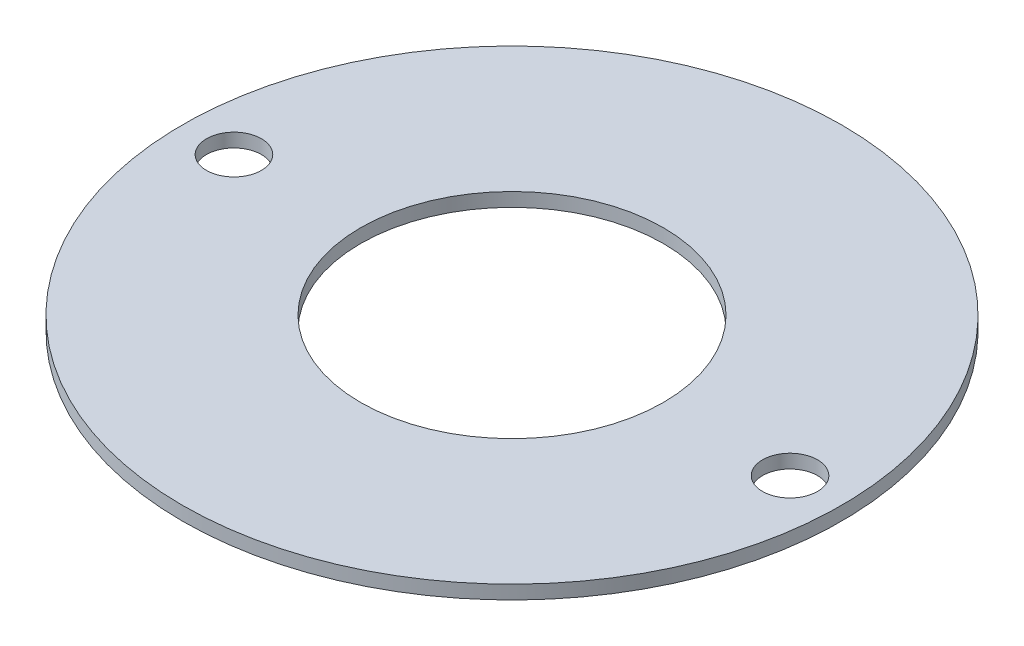
ISO-10303-21;
HEADER;
FILE_DESCRIPTION(('STEP AP214'),'2;1');
FILE_NAME('part.step','',(''),(''),'','','');
FILE_SCHEMA(('AUTOMOTIVE_DESIGN { 1 0 10303 214 1 1 1 1 }'));
ENDSEC;
DATA;
#1=APPLICATION_CONTEXT('core data for automotive mechanical design processes');
#2=APPLICATION_PROTOCOL_DEFINITION('international standard','automotive_design',2000,#1);
#3=PRODUCT_CONTEXT('',#1,'mechanical');
#4=PRODUCT('Part','Part','',(#3));
#5=PRODUCT_RELATED_PRODUCT_CATEGORY('part','',(#4));
#6=PRODUCT_DEFINITION_FORMATION('','',#4);
#7=PRODUCT_DEFINITION_CONTEXT('part definition',#1,'design');
#8=PRODUCT_DEFINITION('design','',#6,#7);
#9=PRODUCT_DEFINITION_SHAPE('','',#8);
#10=(LENGTH_UNIT() NAMED_UNIT(*) SI_UNIT(.MILLI.,.METRE.));
#11=(NAMED_UNIT(*) PLANE_ANGLE_UNIT() SI_UNIT($,.RADIAN.));
#12=(NAMED_UNIT(*) SI_UNIT($,.STERADIAN.) SOLID_ANGLE_UNIT());
#13=UNCERTAINTY_MEASURE_WITH_UNIT(LENGTH_MEASURE(1.E-05),#10,'distance_accuracy_value','');
#14=(GEOMETRIC_REPRESENTATION_CONTEXT(3) GLOBAL_UNCERTAINTY_ASSIGNED_CONTEXT((#13)) GLOBAL_UNIT_ASSIGNED_CONTEXT((#10,
#11,#12)) REPRESENTATION_CONTEXT('',''));
#15=CARTESIAN_POINT('',(0.,0.,0.));
#16=DIRECTION('',(0.,0.,1.));
#17=DIRECTION('',(1.,0.,0.));
#18=AXIS2_PLACEMENT_3D('',#15,#16,#17);
#19=CARTESIAN_POINT('',(0.,3.175,0.));
#20=DIRECTION('',(0.,-1.,0.));
#21=DIRECTION('',(0.,0.,-1.));
#22=AXIS2_PLACEMENT_3D('',#19,#20,#21);
#23=CYLINDRICAL_SURFACE('',#22,76.2);
#24=CARTESIAN_POINT('',(0.,3.175,0.));
#25=DIRECTION('',(0.,1.,0.));
#26=DIRECTION('',(0.,0.,1.));
#27=AXIS2_PLACEMENT_3D('',#24,#25,#26);
#28=CIRCLE('',#27,76.2);
#29=CARTESIAN_POINT('',(0.,3.175,76.2));
#30=VERTEX_POINT('',#29);
#31=EDGE_CURVE('E12',#30,#30,#28,.T.);
#32=ORIENTED_EDGE('',*,*,#31,.F.);
#33=EDGE_LOOP('',(#32));
#34=FACE_BOUND('',#33,.T.);
#35=CARTESIAN_POINT('',(0.,0.,0.));
#36=DIRECTION('',(0.,1.,0.));
#37=DIRECTION('',(0.,0.,1.));
#38=AXIS2_PLACEMENT_3D('',#35,#36,#37);
#39=CIRCLE('',#38,76.2);
#40=CARTESIAN_POINT('',(0.,0.,76.2));
#41=VERTEX_POINT('',#40);
#42=EDGE_CURVE('E49',#41,#41,#39,.T.);
#43=ORIENTED_EDGE('',*,*,#42,.T.);
#44=EDGE_LOOP('',(#43));
#45=FACE_BOUND('',#44,.T.);
#46=ADVANCED_FACE('F42',(#34,#45),#23,.T.);
#47=CARTESIAN_POINT('',(0.,3.175,0.));
#48=DIRECTION('',(0.,1.,0.));
#49=DIRECTION('',(0.,0.,1.));
#50=AXIS2_PLACEMENT_3D('',#47,#48,#49);
#51=PLANE('',#50);
#52=CARTESIAN_POINT('',(64.2875,3.175,0.));
#53=DIRECTION('',(0.,1.,0.));
#54=DIRECTION('',(0.,0.,1.));
#55=AXIS2_PLACEMENT_3D('',#52,#53,#54);
#56=CIRCLE('',#55,6.35);
#57=CARTESIAN_POINT('',(64.2875,3.175,6.35));
#58=VERTEX_POINT('',#57);
#59=EDGE_CURVE('E70',#58,#58,#56,.T.);
#60=ORIENTED_EDGE('',*,*,#59,.F.);
#61=EDGE_LOOP('',(#60));
#62=FACE_BOUND('',#61,.T.);
#63=CARTESIAN_POINT('',(-64.2875,3.175,0.));
#64=DIRECTION('',(0.,1.,0.));
#65=DIRECTION('',(0.,0.,1.));
#66=AXIS2_PLACEMENT_3D('',#63,#64,#65);
#67=CIRCLE('',#66,6.35);
#68=CARTESIAN_POINT('',(-64.2875,3.175,6.35));
#69=VERTEX_POINT('',#68);
#70=EDGE_CURVE('E61',#69,#69,#67,.T.);
#71=ORIENTED_EDGE('',*,*,#70,.F.);
#72=EDGE_LOOP('',(#71));
#73=FACE_BOUND('',#72,.T.);
#74=CARTESIAN_POINT('',(0.,3.175,0.));
#75=DIRECTION('',(0.,1.,0.));
#76=DIRECTION('',(0.,0.,1.));
#77=AXIS2_PLACEMENT_3D('',#74,#75,#76);
#78=CIRCLE('',#77,35.);
#79=CARTESIAN_POINT('',(0.,3.175,35.));
#80=VERTEX_POINT('',#79);
#81=EDGE_CURVE('E57',#80,#80,#78,.T.);
#82=ORIENTED_EDGE('',*,*,#81,.F.);
#83=EDGE_LOOP('',(#82));
#84=FACE_BOUND('',#83,.T.);
#85=ORIENTED_EDGE('',*,*,#31,.T.);
#86=EDGE_LOOP('',(#85));
#87=FACE_BOUND('',#86,.T.);
#88=ADVANCED_FACE('F85',(#62,#73,#84,#87),#51,.T.);
#89=CARTESIAN_POINT('',(0.,0.,0.));
#90=DIRECTION('',(0.,1.,0.));
#91=DIRECTION('',(0.,0.,1.));
#92=AXIS2_PLACEMENT_3D('',#89,#90,#91);
#93=PLANE('',#92);
#94=CARTESIAN_POINT('',(64.2875,0.,0.));
#95=DIRECTION('',(0.,1.,0.));
#96=DIRECTION('',(0.,0.,1.));
#97=AXIS2_PLACEMENT_3D('',#94,#95,#96);
#98=CIRCLE('',#97,6.35);
#99=CARTESIAN_POINT('',(64.2875,0.,6.35));
#100=VERTEX_POINT('',#99);
#101=EDGE_CURVE('E45',#100,#100,#98,.T.);
#102=ORIENTED_EDGE('',*,*,#101,.T.);
#103=EDGE_LOOP('',(#102));
#104=FACE_BOUND('',#103,.T.);
#105=CARTESIAN_POINT('',(-64.2875,0.,0.));
#106=DIRECTION('',(0.,1.,0.));
#107=DIRECTION('',(0.,0.,1.));
#108=AXIS2_PLACEMENT_3D('',#105,#106,#107);
#109=CIRCLE('',#108,6.35);
#110=CARTESIAN_POINT('',(-64.2875,0.,6.35));
#111=VERTEX_POINT('',#110);
#112=EDGE_CURVE('E59',#111,#111,#109,.T.);
#113=ORIENTED_EDGE('',*,*,#112,.T.);
#114=EDGE_LOOP('',(#113));
#115=FACE_BOUND('',#114,.T.);
#116=CARTESIAN_POINT('',(0.,0.,0.));
#117=DIRECTION('',(0.,1.,0.));
#118=DIRECTION('',(0.,0.,1.));
#119=AXIS2_PLACEMENT_3D('',#116,#117,#118);
#120=CIRCLE('',#119,35.);
#121=CARTESIAN_POINT('',(0.,0.,35.));
#122=VERTEX_POINT('',#121);
#123=EDGE_CURVE('E54',#122,#122,#120,.T.);
#124=ORIENTED_EDGE('',*,*,#123,.T.);
#125=EDGE_LOOP('',(#124));
#126=FACE_BOUND('',#125,.T.);
#127=ORIENTED_EDGE('',*,*,#42,.F.);
#128=EDGE_LOOP('',(#127));
#129=FACE_BOUND('',#128,.T.);
#130=ADVANCED_FACE('F75',(#104,#115,#126,#129),#93,.F.);
#131=CARTESIAN_POINT('',(0.,0.,0.));
#132=DIRECTION('',(0.,1.,0.));
#133=DIRECTION('',(0.,0.,1.));
#134=AXIS2_PLACEMENT_3D('',#131,#132,#133);
#135=CYLINDRICAL_SURFACE('',#134,35.);
#136=ORIENTED_EDGE('',*,*,#123,.F.);
#137=EDGE_LOOP('',(#136));
#138=FACE_BOUND('',#137,.T.);
#139=ORIENTED_EDGE('',*,*,#81,.T.);
#140=EDGE_LOOP('',(#139));
#141=FACE_BOUND('',#140,.T.);
#142=ADVANCED_FACE('F78',(#138,#141),#135,.F.);
#143=CARTESIAN_POINT('',(-64.2875,-6.825,0.));
#144=DIRECTION('',(0.,1.,0.));
#145=DIRECTION('',(0.,0.,1.));
#146=AXIS2_PLACEMENT_3D('',#143,#144,#145);
#147=CYLINDRICAL_SURFACE('',#146,6.35);
#148=ORIENTED_EDGE('',*,*,#70,.T.);
#149=EDGE_LOOP('',(#148));
#150=FACE_BOUND('',#149,.T.);
#151=ORIENTED_EDGE('',*,*,#112,.F.);
#152=EDGE_LOOP('',(#151));
#153=FACE_BOUND('',#152,.T.);
#154=ADVANCED_FACE('F81',(#150,#153),#147,.F.);
#155=CARTESIAN_POINT('',(64.2875,-6.825,0.));
#156=DIRECTION('',(0.,1.,0.));
#157=DIRECTION('',(0.,0.,1.));
#158=AXIS2_PLACEMENT_3D('',#155,#156,#157);
#159=CYLINDRICAL_SURFACE('',#158,6.35);
#160=ORIENTED_EDGE('',*,*,#59,.T.);
#161=EDGE_LOOP('',(#160));
#162=FACE_BOUND('',#161,.T.);
#163=ORIENTED_EDGE('',*,*,#101,.F.);
#164=EDGE_LOOP('',(#163));
#165=FACE_BOUND('',#164,.T.);
#166=ADVANCED_FACE('F100',(#162,#165),#159,.F.);
#167=CLOSED_SHELL('',(#46,#88,#130,#142,#154,#166));
#168=MANIFOLD_SOLID_BREP('B2',#167);
#169=ADVANCED_BREP_SHAPE_REPRESENTATION('',(#18,#168),#14);
#170=SHAPE_DEFINITION_REPRESENTATION(#9,#169);
ENDSEC;
END-ISO-10303-21;
